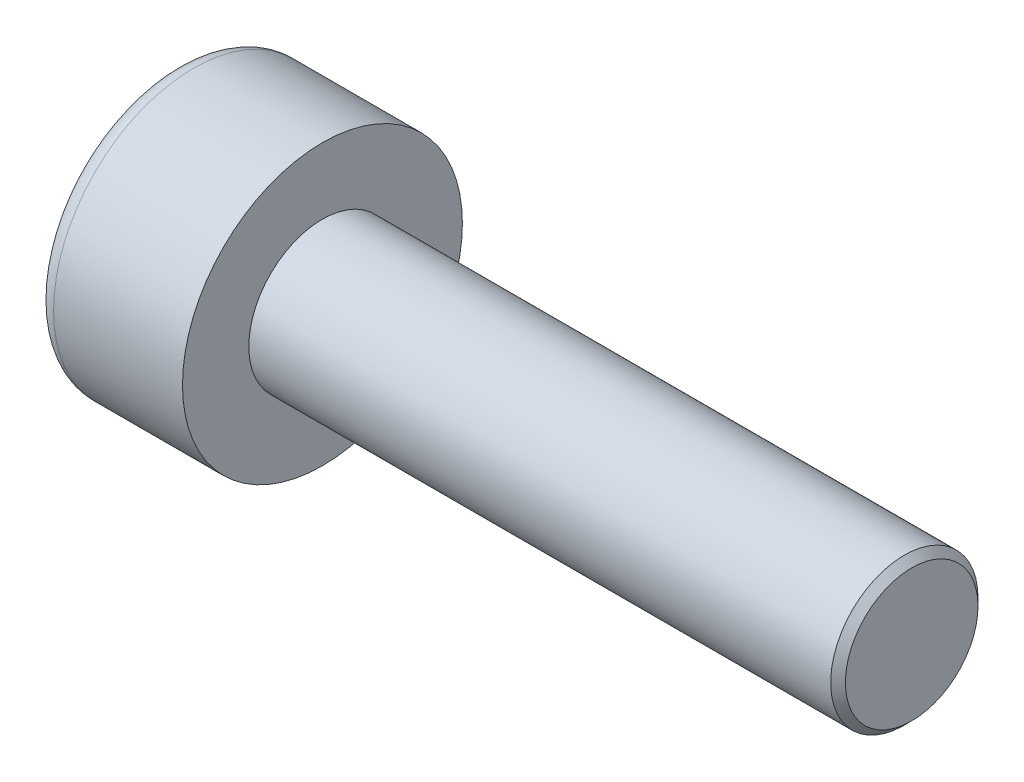
ISO-10303-21;
HEADER;
FILE_DESCRIPTION(('STEP AP214'),'2;1');
FILE_NAME('part.step','',(''),(''),'','','');
FILE_SCHEMA(('AUTOMOTIVE_DESIGN { 1 0 10303 214 1 1 1 1 }'));
ENDSEC;
DATA;
#1=APPLICATION_CONTEXT('core data for automotive mechanical design processes');
#2=APPLICATION_PROTOCOL_DEFINITION('international standard','automotive_design',2000,#1);
#3=PRODUCT_CONTEXT('',#1,'mechanical');
#4=PRODUCT('Part','Part','',(#3));
#5=PRODUCT_RELATED_PRODUCT_CATEGORY('part','',(#4));
#6=PRODUCT_DEFINITION_FORMATION('','',#4);
#7=PRODUCT_DEFINITION_CONTEXT('part definition',#1,'design');
#8=PRODUCT_DEFINITION('design','',#6,#7);
#9=PRODUCT_DEFINITION_SHAPE('','',#8);
#10=(LENGTH_UNIT() NAMED_UNIT(*) SI_UNIT(.MILLI.,.METRE.));
#11=(NAMED_UNIT(*) PLANE_ANGLE_UNIT() SI_UNIT($,.RADIAN.));
#12=(NAMED_UNIT(*) SI_UNIT($,.STERADIAN.) SOLID_ANGLE_UNIT());
#13=UNCERTAINTY_MEASURE_WITH_UNIT(LENGTH_MEASURE(1.E-05),#10,'distance_accuracy_value','');
#14=(GEOMETRIC_REPRESENTATION_CONTEXT(3) GLOBAL_UNCERTAINTY_ASSIGNED_CONTEXT((#13)) GLOBAL_UNIT_ASSIGNED_CONTEXT((#10,
#11,#12)) REPRESENTATION_CONTEXT('',''));
#15=CARTESIAN_POINT('',(0.,0.,0.));
#16=DIRECTION('',(0.,0.,1.));
#17=DIRECTION('',(1.,0.,0.));
#18=AXIS2_PLACEMENT_3D('',#15,#16,#17);
#19=CARTESIAN_POINT('',(1.,-1.5,0.));
#20=DIRECTION('',(-1.,0.,0.));
#21=DIRECTION('',(0.,0.,1.));
#22=AXIS2_PLACEMENT_3D('',#19,#20,#21);
#23=PLANE('',#22);
#24=DIRECTION('',(0.,-0.866025403784438,-0.5));
#25=VECTOR('',#24,1.);
#26=CARTESIAN_POINT('',(1.,0.,0.866025403784439));
#27=LINE('',#26,#25);
#28=CARTESIAN_POINT('',(1.,-0.375,0.649519052838329));
#29=VERTEX_POINT('',#28);
#30=CARTESIAN_POINT('',(1.,-0.749999999999999,0.433012701892219));
#31=VERTEX_POINT('',#30);
#32=EDGE_CURVE('E157',#29,#31,#27,.T.);
#33=ORIENTED_EDGE('',*,*,#32,.F.);
#34=CARTESIAN_POINT('',(1.,0.,0.));
#35=DIRECTION('',(-1.,0.,0.));
#36=DIRECTION('',(0.,0.,1.));
#37=AXIS2_PLACEMENT_3D('',#34,#35,#36);
#38=CIRCLE('',#37,0.75);
#39=CARTESIAN_POINT('',(1.,-0.75,0.));
#40=VERTEX_POINT('',#39);
#41=EDGE_CURVE('E52',#29,#40,#38,.F.);
#42=ORIENTED_EDGE('',*,*,#41,.T.);
#43=DIRECTION('',(0.,0.,-1.));
#44=VECTOR('',#43,1.);
#45=CARTESIAN_POINT('',(1.,-0.749999999999999,0.433012701892219));
#46=LINE('',#45,#44);
#47=EDGE_CURVE('E162',#31,#40,#46,.T.);
#48=ORIENTED_EDGE('',*,*,#47,.F.);
#49=EDGE_LOOP('',(#33,#42,#48));
#50=FACE_BOUND('',#49,.T.);
#51=ADVANCED_FACE('F37',(#50),#23,.T.);
#52=CARTESIAN_POINT('',(1.,-0.75,-0.43301270189222));
#53=VERTEX_POINT('',#52);
#54=EDGE_CURVE('E161',#40,#53,#46,.T.);
#55=ORIENTED_EDGE('',*,*,#54,.F.);
#56=CARTESIAN_POINT('',(1.,-0.375,-0.649519052838329));
#57=VERTEX_POINT('',#56);
#58=EDGE_CURVE('E137',#40,#57,#38,.F.);
#59=ORIENTED_EDGE('',*,*,#58,.T.);
#60=DIRECTION('',(0.,0.866025403784439,-0.5));
#61=VECTOR('',#60,1.);
#62=CARTESIAN_POINT('',(1.,-0.75,-0.43301270189222));
#63=LINE('',#62,#61);
#64=EDGE_CURVE('E145',#53,#57,#63,.T.);
#65=ORIENTED_EDGE('',*,*,#64,.F.);
#66=EDGE_LOOP('',(#55,#59,#65));
#67=FACE_BOUND('',#66,.T.);
#68=ADVANCED_FACE('F218',(#67),#23,.T.);
#69=CARTESIAN_POINT('',(1.,0.,-0.866025403784439));
#70=VERTEX_POINT('',#69);
#71=EDGE_CURVE('E135',#57,#70,#63,.T.);
#72=ORIENTED_EDGE('',*,*,#71,.F.);
#73=CARTESIAN_POINT('',(1.,0.375,-0.649519052838328));
#74=VERTEX_POINT('',#73);
#75=EDGE_CURVE('E119',#57,#74,#38,.F.);
#76=ORIENTED_EDGE('',*,*,#75,.T.);
#77=DIRECTION('',(0.,0.866025403784438,0.5));
#78=VECTOR('',#77,1.);
#79=CARTESIAN_POINT('',(1.,0.,-0.866025403784439));
#80=LINE('',#79,#78);
#81=EDGE_CURVE('E133',#70,#74,#80,.T.);
#82=ORIENTED_EDGE('',*,*,#81,.F.);
#83=EDGE_LOOP('',(#72,#76,#82));
#84=FACE_BOUND('',#83,.T.);
#85=ADVANCED_FACE('F131',(#84),#23,.T.);
#86=CARTESIAN_POINT('',(1.,0.75,-0.433012701892219));
#87=VERTEX_POINT('',#86);
#88=EDGE_CURVE('E139',#74,#87,#80,.T.);
#89=ORIENTED_EDGE('',*,*,#88,.F.);
#90=CARTESIAN_POINT('',(1.,0.,0.));
#91=DIRECTION('',(1.,0.,0.));
#92=DIRECTION('',(0.,0.,-1.));
#93=AXIS2_PLACEMENT_3D('',#90,#91,#92);
#94=CIRCLE('',#93,0.75);
#95=CARTESIAN_POINT('',(1.,0.75,0.));
#96=VERTEX_POINT('',#95);
#97=EDGE_CURVE('E117',#74,#96,#94,.T.);
#98=ORIENTED_EDGE('',*,*,#97,.T.);
#99=DIRECTION('',(0.,0.,1.));
#100=VECTOR('',#99,1.);
#101=CARTESIAN_POINT('',(1.,0.75,-0.433012701892219));
#102=LINE('',#101,#100);
#103=EDGE_CURVE('E142',#87,#96,#102,.T.);
#104=ORIENTED_EDGE('',*,*,#103,.F.);
#105=EDGE_LOOP('',(#89,#98,#104));
#106=FACE_BOUND('',#105,.T.);
#107=ADVANCED_FACE('F140',(#106),#23,.T.);
#108=CARTESIAN_POINT('',(1.,0.75,0.433012701892219));
#109=VERTEX_POINT('',#108);
#110=EDGE_CURVE('E149',#96,#109,#102,.T.);
#111=ORIENTED_EDGE('',*,*,#110,.F.);
#112=CARTESIAN_POINT('',(1.,0.375,0.649519052838329));
#113=VERTEX_POINT('',#112);
#114=EDGE_CURVE('E122',#96,#113,#38,.F.);
#115=ORIENTED_EDGE('',*,*,#114,.T.);
#116=DIRECTION('',(0.,-0.866025403784438,0.5));
#117=VECTOR('',#116,1.);
#118=CARTESIAN_POINT('',(1.,0.75,0.433012701892219));
#119=LINE('',#118,#117);
#120=EDGE_CURVE('E154',#109,#113,#119,.T.);
#121=ORIENTED_EDGE('',*,*,#120,.F.);
#122=EDGE_LOOP('',(#111,#115,#121));
#123=FACE_BOUND('',#122,.T.);
#124=ADVANCED_FACE('F230',(#123),#23,.T.);
#125=CARTESIAN_POINT('',(1.,0.,0.866025403784439));
#126=VERTEX_POINT('',#125);
#127=EDGE_CURVE('E153',#113,#126,#119,.T.);
#128=ORIENTED_EDGE('',*,*,#127,.F.);
#129=EDGE_CURVE('E198',#113,#29,#38,.F.);
#130=ORIENTED_EDGE('',*,*,#129,.T.);
#131=EDGE_CURVE('E158',#126,#29,#27,.T.);
#132=ORIENTED_EDGE('',*,*,#131,.F.);
#133=EDGE_LOOP('',(#128,#130,#132));
#134=FACE_BOUND('',#133,.T.);
#135=ADVANCED_FACE('F221',(#134),#23,.T.);
#136=CARTESIAN_POINT('',(0.,0.,0.));
#137=DIRECTION('',(1.,0.,0.));
#138=DIRECTION('',(0.,0.,-1.));
#139=AXIS2_PLACEMENT_3D('',#136,#137,#138);
#140=PLANE('',#139);
#141=CARTESIAN_POINT('',(0.,0.,0.));
#142=DIRECTION('',(1.,0.,0.));
#143=DIRECTION('',(0.,0.,-1.));
#144=AXIS2_PLACEMENT_3D('',#141,#142,#143);
#145=CIRCLE('',#144,1.65);
#146=CARTESIAN_POINT('',(0.,0.,-1.65));
#147=VERTEX_POINT('',#146);
#148=EDGE_CURVE('E203',#147,#147,#145,.F.);
#149=ORIENTED_EDGE('',*,*,#148,.T.);
#150=EDGE_LOOP('',(#149));
#151=FACE_BOUND('',#150,.T.);
#152=DIRECTION('',(0.,0.866025403784439,-0.5));
#153=VECTOR('',#152,1.);
#154=CARTESIAN_POINT('',(0.,-0.75,-0.43301270189222));
#155=LINE('',#154,#153);
#156=CARTESIAN_POINT('',(0.,-0.75,-0.43301270189222));
#157=VERTEX_POINT('',#156);
#158=CARTESIAN_POINT('',(0.,0.,-0.866025403784439));
#159=VERTEX_POINT('',#158);
#160=EDGE_CURVE('E60',#157,#159,#155,.T.);
#161=ORIENTED_EDGE('',*,*,#160,.T.);
#162=DIRECTION('',(0.,0.866025403784438,0.5));
#163=VECTOR('',#162,1.);
#164=CARTESIAN_POINT('',(0.,0.,-0.866025403784439));
#165=LINE('',#164,#163);
#166=CARTESIAN_POINT('',(0.,0.75,-0.433012701892219));
#167=VERTEX_POINT('',#166);
#168=EDGE_CURVE('E167',#159,#167,#165,.T.);
#169=ORIENTED_EDGE('',*,*,#168,.T.);
#170=DIRECTION('',(0.,0.,1.));
#171=VECTOR('',#170,1.);
#172=CARTESIAN_POINT('',(0.,0.75,-0.433012701892219));
#173=LINE('',#172,#171);
#174=CARTESIAN_POINT('',(0.,0.75,0.433012701892219));
#175=VERTEX_POINT('',#174);
#176=EDGE_CURVE('E170',#167,#175,#173,.T.);
#177=ORIENTED_EDGE('',*,*,#176,.T.);
#178=DIRECTION('',(0.,-0.866025403784438,0.5));
#179=VECTOR('',#178,1.);
#180=CARTESIAN_POINT('',(0.,0.75,0.433012701892219));
#181=LINE('',#180,#179);
#182=CARTESIAN_POINT('',(0.,0.,0.866025403784439));
#183=VERTEX_POINT('',#182);
#184=EDGE_CURVE('E173',#175,#183,#181,.T.);
#185=ORIENTED_EDGE('',*,*,#184,.T.);
#186=DIRECTION('',(0.,-0.866025403784438,-0.5));
#187=VECTOR('',#186,1.);
#188=CARTESIAN_POINT('',(0.,0.,0.866025403784439));
#189=LINE('',#188,#187);
#190=CARTESIAN_POINT('',(0.,-0.749999999999999,0.433012701892219));
#191=VERTEX_POINT('',#190);
#192=EDGE_CURVE('E176',#183,#191,#189,.T.);
#193=ORIENTED_EDGE('',*,*,#192,.T.);
#194=DIRECTION('',(0.,0.,-1.));
#195=VECTOR('',#194,1.);
#196=CARTESIAN_POINT('',(0.,-0.749999999999999,0.433012701892219));
#197=LINE('',#196,#195);
#198=EDGE_CURVE('E179',#191,#157,#197,.T.);
#199=ORIENTED_EDGE('',*,*,#198,.T.);
#200=EDGE_LOOP('',(#161,#169,#177,#185,#193,#199));
#201=FACE_BOUND('',#200,.T.);
#202=ADVANCED_FACE('F229',(#151,#201),#140,.F.);
#203=CARTESIAN_POINT('',(2.,0.,0.));
#204=DIRECTION('',(1.,0.,0.));
#205=DIRECTION('',(0.,0.,-1.));
#206=AXIS2_PLACEMENT_3D('',#203,#204,#205);
#207=PLANE('',#206);
#208=CARTESIAN_POINT('',(2.,0.,0.));
#209=DIRECTION('',(1.,0.,0.));
#210=DIRECTION('',(0.,0.,-1.));
#211=AXIS2_PLACEMENT_3D('',#208,#209,#210);
#212=CIRCLE('',#211,1.9);
#213=CARTESIAN_POINT('',(2.,0.,-1.9));
#214=VERTEX_POINT('',#213);
#215=EDGE_CURVE('E195',#214,#214,#212,.T.);
#216=ORIENTED_EDGE('',*,*,#215,.T.);
#217=EDGE_LOOP('',(#216));
#218=FACE_BOUND('',#217,.T.);
#219=CARTESIAN_POINT('',(2.,0.,0.));
#220=DIRECTION('',(1.,0.,0.));
#221=DIRECTION('',(0.,0.,-1.));
#222=AXIS2_PLACEMENT_3D('',#219,#220,#221);
#223=CIRCLE('',#222,1.);
#224=CARTESIAN_POINT('',(2.,0.,-1.));
#225=VERTEX_POINT('',#224);
#226=EDGE_CURVE('E192',#225,#225,#223,.T.);
#227=ORIENTED_EDGE('',*,*,#226,.F.);
#228=EDGE_LOOP('',(#227));
#229=FACE_BOUND('',#228,.T.);
#230=ADVANCED_FACE('F236',(#218,#229),#207,.T.);
#231=CARTESIAN_POINT('',(2.,0.,0.));
#232=DIRECTION('',(-1.,0.,0.));
#233=DIRECTION('',(0.,0.,1.));
#234=AXIS2_PLACEMENT_3D('',#231,#232,#233);
#235=CYLINDRICAL_SURFACE('',#234,1.9);
#236=CARTESIAN_POINT('',(0.25,0.,0.));
#237=DIRECTION('',(1.,0.,0.));
#238=DIRECTION('',(0.,0.,-1.));
#239=AXIS2_PLACEMENT_3D('',#236,#237,#238);
#240=CIRCLE('',#239,1.9);
#241=CARTESIAN_POINT('',(0.25,0.,-1.9));
#242=VERTEX_POINT('',#241);
#243=EDGE_CURVE('E200',#242,#242,#240,.T.);
#244=ORIENTED_EDGE('',*,*,#243,.T.);
#245=EDGE_LOOP('',(#244));
#246=FACE_BOUND('',#245,.T.);
#247=ORIENTED_EDGE('',*,*,#215,.F.);
#248=EDGE_LOOP('',(#247));
#249=FACE_BOUND('',#248,.T.);
#250=ADVANCED_FACE('F281',(#246,#249),#235,.T.);
#251=CARTESIAN_POINT('',(10.,0.,0.));
#252=DIRECTION('',(-1.,0.,0.));
#253=DIRECTION('',(0.,0.,1.));
#254=AXIS2_PLACEMENT_3D('',#251,#252,#253);
#255=CYLINDRICAL_SURFACE('',#254,1.);
#256=CARTESIAN_POINT('',(9.9,0.,0.));
#257=DIRECTION('',(1.,0.,0.));
#258=DIRECTION('',(0.,0.,-1.));
#259=AXIS2_PLACEMENT_3D('',#256,#257,#258);
#260=CIRCLE('',#259,1.);
#261=CARTESIAN_POINT('',(9.9,0.,-1.));
#262=VERTEX_POINT('',#261);
#263=EDGE_CURVE('E11',#262,#262,#260,.F.);
#264=ORIENTED_EDGE('',*,*,#263,.T.);
#265=EDGE_LOOP('',(#264));
#266=FACE_BOUND('',#265,.T.);
#267=ORIENTED_EDGE('',*,*,#226,.T.);
#268=EDGE_LOOP('',(#267));
#269=FACE_BOUND('',#268,.T.);
#270=ADVANCED_FACE('F278',(#266,#269),#255,.T.);
#271=CARTESIAN_POINT('',(10.,0.,0.));
#272=DIRECTION('',(1.,0.,0.));
#273=DIRECTION('',(0.,0.,-1.));
#274=AXIS2_PLACEMENT_3D('',#271,#272,#273);
#275=PLANE('',#274);
#276=CARTESIAN_POINT('',(10.,0.,0.));
#277=DIRECTION('',(1.,0.,0.));
#278=DIRECTION('',(0.,0.,-1.));
#279=AXIS2_PLACEMENT_3D('',#276,#277,#278);
#280=CIRCLE('',#279,0.9);
#281=CARTESIAN_POINT('',(10.,0.,-0.9));
#282=VERTEX_POINT('',#281);
#283=EDGE_CURVE('E45',#282,#282,#280,.T.);
#284=ORIENTED_EDGE('',*,*,#283,.T.);
#285=EDGE_LOOP('',(#284));
#286=FACE_BOUND('',#285,.T.);
#287=ADVANCED_FACE('F208',(#286),#275,.T.);
#288=CARTESIAN_POINT('',(1.,-0.75,-0.43301270189222));
#289=DIRECTION('',(0.,0.5,0.866025403784439));
#290=DIRECTION('',(0.,-0.866025403784439,0.5));
#291=AXIS2_PLACEMENT_3D('',#288,#289,#290);
#292=PLANE('',#291);
#293=ORIENTED_EDGE('',*,*,#160,.F.);
#294=DIRECTION('',(-1.,0.,0.));
#295=VECTOR('',#294,1.);
#296=CARTESIAN_POINT('',(1.,-0.75,-0.43301270189222));
#297=LINE('',#296,#295);
#298=EDGE_CURVE('E165',#53,#157,#297,.T.);
#299=ORIENTED_EDGE('',*,*,#298,.F.);
#300=ORIENTED_EDGE('',*,*,#64,.T.);
#301=ORIENTED_EDGE('',*,*,#71,.T.);
#302=DIRECTION('',(-1.,0.,0.));
#303=VECTOR('',#302,1.);
#304=CARTESIAN_POINT('',(1.,0.,-0.866025403784439));
#305=LINE('',#304,#303);
#306=EDGE_CURVE('E148',#70,#159,#305,.T.);
#307=ORIENTED_EDGE('',*,*,#306,.T.);
#308=EDGE_LOOP('',(#293,#299,#300,#301,#307));
#309=FACE_BOUND('',#308,.T.);
#310=ADVANCED_FACE('F252',(#309),#292,.T.);
#311=CARTESIAN_POINT('',(1.,0.,-0.866025403784439));
#312=DIRECTION('',(0.,-0.5,0.866025403784438));
#313=DIRECTION('',(0.,-0.866025403784438,-0.5));
#314=AXIS2_PLACEMENT_3D('',#311,#312,#313);
#315=PLANE('',#314);
#316=ORIENTED_EDGE('',*,*,#168,.F.);
#317=ORIENTED_EDGE('',*,*,#306,.F.);
#318=ORIENTED_EDGE('',*,*,#81,.T.);
#319=ORIENTED_EDGE('',*,*,#88,.T.);
#320=DIRECTION('',(-1.,0.,0.));
#321=VECTOR('',#320,1.);
#322=CARTESIAN_POINT('',(1.,0.75,-0.433012701892219));
#323=LINE('',#322,#321);
#324=EDGE_CURVE('E189',#87,#167,#323,.T.);
#325=ORIENTED_EDGE('',*,*,#324,.T.);
#326=EDGE_LOOP('',(#316,#317,#318,#319,#325));
#327=FACE_BOUND('',#326,.T.);
#328=ADVANCED_FACE('F147',(#327),#315,.T.);
#329=CARTESIAN_POINT('',(1.,0.75,-0.433012701892219));
#330=DIRECTION('',(0.,-1.,0.));
#331=DIRECTION('',(0.,0.,-1.));
#332=AXIS2_PLACEMENT_3D('',#329,#330,#331);
#333=PLANE('',#332);
#334=ORIENTED_EDGE('',*,*,#176,.F.);
#335=ORIENTED_EDGE('',*,*,#324,.F.);
#336=ORIENTED_EDGE('',*,*,#103,.T.);
#337=ORIENTED_EDGE('',*,*,#110,.T.);
#338=DIRECTION('',(-1.,0.,0.));
#339=VECTOR('',#338,1.);
#340=CARTESIAN_POINT('',(1.,0.75,0.433012701892219));
#341=LINE('',#340,#339);
#342=EDGE_CURVE('E187',#109,#175,#341,.T.);
#343=ORIENTED_EDGE('',*,*,#342,.T.);
#344=EDGE_LOOP('',(#334,#335,#336,#337,#343));
#345=FACE_BOUND('',#344,.T.);
#346=ADVANCED_FACE('F250',(#345),#333,.T.);
#347=CARTESIAN_POINT('',(1.,0.75,0.433012701892219));
#348=DIRECTION('',(0.,-0.5,-0.866025403784439));
#349=DIRECTION('',(0.,0.866025403784438,-0.5));
#350=AXIS2_PLACEMENT_3D('',#347,#348,#349);
#351=PLANE('',#350);
#352=ORIENTED_EDGE('',*,*,#184,.F.);
#353=ORIENTED_EDGE('',*,*,#342,.F.);
#354=ORIENTED_EDGE('',*,*,#120,.T.);
#355=ORIENTED_EDGE('',*,*,#127,.T.);
#356=DIRECTION('',(-1.,0.,0.));
#357=VECTOR('',#356,1.);
#358=CARTESIAN_POINT('',(1.,0.,0.866025403784439));
#359=LINE('',#358,#357);
#360=EDGE_CURVE('E185',#126,#183,#359,.T.);
#361=ORIENTED_EDGE('',*,*,#360,.T.);
#362=EDGE_LOOP('',(#352,#353,#354,#355,#361));
#363=FACE_BOUND('',#362,.T.);
#364=ADVANCED_FACE('F247',(#363),#351,.T.);
#365=CARTESIAN_POINT('',(1.,0.,0.866025403784439));
#366=DIRECTION('',(0.,0.5,-0.866025403784439));
#367=DIRECTION('',(0.,0.866025403784438,0.5));
#368=AXIS2_PLACEMENT_3D('',#365,#366,#367);
#369=PLANE('',#368);
#370=ORIENTED_EDGE('',*,*,#192,.F.);
#371=ORIENTED_EDGE('',*,*,#360,.F.);
#372=ORIENTED_EDGE('',*,*,#131,.T.);
#373=ORIENTED_EDGE('',*,*,#32,.T.);
#374=DIRECTION('',(-1.,0.,0.));
#375=VECTOR('',#374,1.);
#376=CARTESIAN_POINT('',(1.,-0.749999999999999,0.433012701892219));
#377=LINE('',#376,#375);
#378=EDGE_CURVE('E183',#31,#191,#377,.T.);
#379=ORIENTED_EDGE('',*,*,#378,.T.);
#380=EDGE_LOOP('',(#370,#371,#372,#373,#379));
#381=FACE_BOUND('',#380,.T.);
#382=ADVANCED_FACE('F261',(#381),#369,.T.);
#383=CARTESIAN_POINT('',(1.,-0.749999999999999,0.433012701892219));
#384=DIRECTION('',(0.,1.,0.));
#385=DIRECTION('',(0.,0.,1.));
#386=AXIS2_PLACEMENT_3D('',#383,#384,#385);
#387=PLANE('',#386);
#388=ORIENTED_EDGE('',*,*,#198,.F.);
#389=ORIENTED_EDGE('',*,*,#378,.F.);
#390=ORIENTED_EDGE('',*,*,#47,.T.);
#391=ORIENTED_EDGE('',*,*,#54,.T.);
#392=ORIENTED_EDGE('',*,*,#298,.T.);
#393=EDGE_LOOP('',(#388,#389,#390,#391,#392));
#394=FACE_BOUND('',#393,.T.);
#395=ADVANCED_FACE('F114',(#394),#387,.T.);
#396=CARTESIAN_POINT('',(1.,0.,0.));
#397=DIRECTION('',(-1.,0.,0.));
#398=DIRECTION('',(0.,0.,1.));
#399=AXIS2_PLACEMENT_3D('',#396,#397,#398);
#400=CONICAL_SURFACE('',#399,0.75,1.04719755119659);
#401=CARTESIAN_POINT('',(1.43301270189222,0.,0.));
#402=VERTEX_POINT('',#401);
#403=VERTEX_LOOP('',#402);
#404=FACE_BOUND('',#403,.T.);
#405=ORIENTED_EDGE('',*,*,#97,.F.);
#406=ORIENTED_EDGE('',*,*,#75,.F.);
#407=ORIENTED_EDGE('',*,*,#58,.F.);
#408=ORIENTED_EDGE('',*,*,#41,.F.);
#409=ORIENTED_EDGE('',*,*,#129,.F.);
#410=ORIENTED_EDGE('',*,*,#114,.F.);
#411=EDGE_LOOP('',(#405,#406,#407,#408,#409,#410));
#412=FACE_BOUND('',#411,.T.);
#413=ADVANCED_FACE('F111',(#404,#412),#400,.F.);
#414=CARTESIAN_POINT('',(0.25,0.,0.));
#415=DIRECTION('',(1.,0.,0.));
#416=DIRECTION('',(0.,0.,-1.));
#417=AXIS2_PLACEMENT_3D('',#414,#415,#416);
#418=TOROIDAL_SURFACE('',#417,1.65,0.25);
#419=ORIENTED_EDGE('',*,*,#148,.F.);
#420=EDGE_LOOP('',(#419));
#421=FACE_BOUND('',#420,.T.);
#422=ORIENTED_EDGE('',*,*,#243,.F.);
#423=EDGE_LOOP('',(#422));
#424=FACE_BOUND('',#423,.T.);
#425=ADVANCED_FACE('F113',(#421,#424),#418,.T.);
#426=CARTESIAN_POINT('',(10.,0.,0.));
#427=DIRECTION('',(-1.,0.,0.));
#428=DIRECTION('',(0.,0.,1.));
#429=AXIS2_PLACEMENT_3D('',#426,#427,#428);
#430=CONICAL_SURFACE('',#429,0.9,0.785398163397444);
#431=ORIENTED_EDGE('',*,*,#263,.F.);
#432=EDGE_LOOP('',(#431));
#433=FACE_BOUND('',#432,.T.);
#434=ORIENTED_EDGE('',*,*,#283,.F.);
#435=EDGE_LOOP('',(#434));
#436=FACE_BOUND('',#435,.T.);
#437=ADVANCED_FACE('F39',(#433,#436),#430,.T.);
#438=CLOSED_SHELL('',(#51,#68,#85,#107,#124,#135,#202,#230,#250,#270,#287,#310,#328,#346,#364,
#382,#395,#413,#425,#437));
#439=MANIFOLD_SOLID_BREP('B2',#438);
#440=ADVANCED_BREP_SHAPE_REPRESENTATION('',(#18,#439),#14);
#441=SHAPE_DEFINITION_REPRESENTATION(#9,#440);
ENDSEC;
END-ISO-10303-21;
